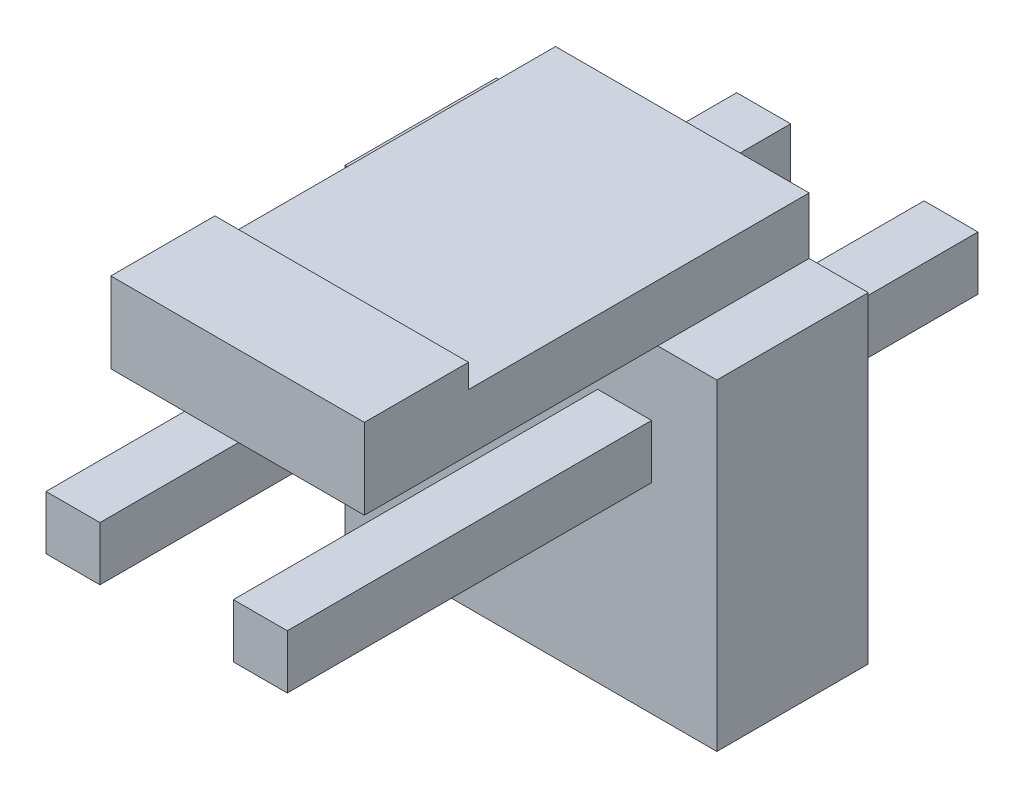
ISO-10303-21;
HEADER;
FILE_DESCRIPTION(('STEP AP214'),'2;1');
FILE_NAME('part.step','',(''),(''),'','','');
FILE_SCHEMA(('AUTOMOTIVE_DESIGN { 1 0 10303 214 1 1 1 1 }'));
ENDSEC;
DATA;
#1=APPLICATION_CONTEXT('core data for automotive mechanical design processes');
#2=APPLICATION_PROTOCOL_DEFINITION('international standard','automotive_design',2000,#1);
#3=PRODUCT_CONTEXT('',#1,'mechanical');
#4=PRODUCT('Part','Part','',(#3));
#5=PRODUCT_RELATED_PRODUCT_CATEGORY('part','',(#4));
#6=PRODUCT_DEFINITION_FORMATION('','',#4);
#7=PRODUCT_DEFINITION_CONTEXT('part definition',#1,'design');
#8=PRODUCT_DEFINITION('design','',#6,#7);
#9=PRODUCT_DEFINITION_SHAPE('','',#8);
#10=(LENGTH_UNIT() NAMED_UNIT(*) SI_UNIT(.MILLI.,.METRE.));
#11=(NAMED_UNIT(*) PLANE_ANGLE_UNIT() SI_UNIT($,.RADIAN.));
#12=(NAMED_UNIT(*) SI_UNIT($,.STERADIAN.) SOLID_ANGLE_UNIT());
#13=UNCERTAINTY_MEASURE_WITH_UNIT(LENGTH_MEASURE(1.E-05),#10,'distance_accuracy_value','');
#14=(GEOMETRIC_REPRESENTATION_CONTEXT(3) GLOBAL_UNCERTAINTY_ASSIGNED_CONTEXT((#13)) GLOBAL_UNIT_ASSIGNED_CONTEXT((#10,
#11,#12)) REPRESENTATION_CONTEXT('',''));
#15=CARTESIAN_POINT('',(0.,0.,0.));
#16=DIRECTION('',(0.,0.,1.));
#17=DIRECTION('',(1.,0.,0.));
#18=AXIS2_PLACEMENT_3D('',#15,#16,#17);
#19=CARTESIAN_POINT('',(1.41000000000004,0.495315795898456,10.9));
#20=DIRECTION('',(1.,0.,0.));
#21=DIRECTION('',(0.,0.,-1.));
#22=AXIS2_PLACEMENT_3D('',#19,#20,#21);
#23=PLANE('',#22);
#24=DIRECTION('',(0.,0.,1.));
#25=VECTOR('',#24,1.);
#26=CARTESIAN_POINT('',(1.41,-0.644684204101545,10.9));
#27=LINE('',#26,#25);
#28=CARTESIAN_POINT('',(1.41,-0.644684204101562,3.2));
#29=VERTEX_POINT('',#28);
#30=CARTESIAN_POINT('',(1.41000000000003,-0.644684204101545,10.9));
#31=VERTEX_POINT('',#30);
#32=EDGE_CURVE('E11',#29,#31,#27,.T.);
#33=ORIENTED_EDGE('',*,*,#32,.T.);
#34=DIRECTION('',(0.,-1.,0.));
#35=VECTOR('',#34,1.);
#36=CARTESIAN_POINT('',(1.41000000000004,-0.644684204101545,10.9));
#37=LINE('',#36,#35);
#38=CARTESIAN_POINT('',(1.41000000000004,0.495315795898449,10.9));
#39=VERTEX_POINT('',#38);
#40=EDGE_CURVE('E407',#39,#31,#37,.T.);
#41=ORIENTED_EDGE('',*,*,#40,.F.);
#42=DIRECTION('',(0.,0.,-1.));
#43=VECTOR('',#42,1.);
#44=CARTESIAN_POINT('',(1.41000000000004,0.495315795898456,10.9));
#45=LINE('',#44,#43);
#46=CARTESIAN_POINT('',(1.41000000000002,0.495315795898425,3.2));
#47=VERTEX_POINT('',#46);
#48=EDGE_CURVE('E388',#39,#47,#45,.T.);
#49=ORIENTED_EDGE('',*,*,#48,.T.);
#50=DIRECTION('',(0.,1.,0.));
#51=VECTOR('',#50,1.);
#52=CARTESIAN_POINT('',(1.41,0.495315795898453,3.2));
#53=LINE('',#52,#51);
#54=EDGE_CURVE('E300',#29,#47,#53,.T.);
#55=ORIENTED_EDGE('',*,*,#54,.F.);
#56=EDGE_LOOP('',(#33,#41,#49,#55));
#57=FACE_BOUND('',#56,.T.);
#58=ADVANCED_FACE('F17',(#57),#23,.F.);
#59=CARTESIAN_POINT('',(-2.54999999999996,0.495315795898457,10.9));
#60=DIRECTION('',(1.,0.,0.));
#61=DIRECTION('',(0.,0.,-1.));
#62=AXIS2_PLACEMENT_3D('',#59,#60,#61);
#63=PLANE('',#62);
#64=DIRECTION('',(0.,0.,1.));
#65=VECTOR('',#64,1.);
#66=CARTESIAN_POINT('',(-2.55,-0.644684204101544,10.9));
#67=LINE('',#66,#65);
#68=CARTESIAN_POINT('',(-2.55,-0.64468420410156,3.2));
#69=VERTEX_POINT('',#68);
#70=CARTESIAN_POINT('',(-2.55,-0.644684204101544,10.9));
#71=VERTEX_POINT('',#70);
#72=EDGE_CURVE('E392',#69,#71,#67,.T.);
#73=ORIENTED_EDGE('',*,*,#72,.T.);
#74=DIRECTION('',(0.,-1.,0.));
#75=VECTOR('',#74,1.);
#76=CARTESIAN_POINT('',(-2.54999999999996,-0.644684204101544,10.9));
#77=LINE('',#76,#75);
#78=CARTESIAN_POINT('',(-2.54999999999996,0.495315795898449,10.9));
#79=VERTEX_POINT('',#78);
#80=EDGE_CURVE('E336',#79,#71,#77,.T.);
#81=ORIENTED_EDGE('',*,*,#80,.F.);
#82=DIRECTION('',(0.,0.,-1.));
#83=VECTOR('',#82,1.);
#84=CARTESIAN_POINT('',(-2.54999999999996,0.495315795898457,10.9));
#85=LINE('',#84,#83);
#86=CARTESIAN_POINT('',(-2.55,0.495315795898426,3.2));
#87=VERTEX_POINT('',#86);
#88=EDGE_CURVE('E387',#79,#87,#85,.T.);
#89=ORIENTED_EDGE('',*,*,#88,.T.);
#90=DIRECTION('',(0.,1.,0.));
#91=VECTOR('',#90,1.);
#92=CARTESIAN_POINT('',(-2.55,0.495315795898454,3.2));
#93=LINE('',#92,#91);
#94=EDGE_CURVE('E350',#69,#87,#93,.T.);
#95=ORIENTED_EDGE('',*,*,#94,.F.);
#96=EDGE_LOOP('',(#73,#81,#89,#95));
#97=FACE_BOUND('',#96,.T.);
#98=ADVANCED_FACE('F611',(#97),#63,.F.);
#99=CARTESIAN_POINT('',(1.41000000000004,-0.644684204101545,10.9));
#100=DIRECTION('',(0.,1.,0.));
#101=DIRECTION('',(0.,0.,-1.));
#102=AXIS2_PLACEMENT_3D('',#99,#100,#101);
#103=PLANE('',#102);
#104=DIRECTION('',(0.,0.,1.));
#105=VECTOR('',#104,1.);
#106=CARTESIAN_POINT('',(2.55000000000004,-0.644684204101574,10.9));
#107=LINE('',#106,#105);
#108=CARTESIAN_POINT('',(2.55,-0.644684204101576,3.2));
#109=VERTEX_POINT('',#108);
#110=CARTESIAN_POINT('',(2.55000000000004,-0.644684204101552,10.9));
#111=VERTEX_POINT('',#110);
#112=EDGE_CURVE('E396',#109,#111,#107,.T.);
#113=ORIENTED_EDGE('',*,*,#112,.T.);
#114=DIRECTION('',(1.,0.,0.));
#115=VECTOR('',#114,1.);
#116=CARTESIAN_POINT('',(1.41000000000004,-0.644684204101545,10.9));
#117=LINE('',#116,#115);
#118=EDGE_CURVE('E28',#31,#111,#117,.T.);
#119=ORIENTED_EDGE('',*,*,#118,.F.);
#120=ORIENTED_EDGE('',*,*,#32,.F.);
#121=DIRECTION('',(-1.,0.,0.));
#122=VECTOR('',#121,1.);
#123=CARTESIAN_POINT('',(1.41000000000004,-0.644684204101576,3.2));
#124=LINE('',#123,#122);
#125=EDGE_CURVE('E428',#109,#29,#124,.T.);
#126=ORIENTED_EDGE('',*,*,#125,.F.);
#127=EDGE_LOOP('',(#113,#119,#120,#126));
#128=FACE_BOUND('',#127,.T.);
#129=ADVANCED_FACE('F557',(#128),#103,.F.);
#130=CARTESIAN_POINT('',(1.41000000000004,-0.644684204101545,10.9));
#131=DIRECTION('',(0.,0.,1.));
#132=DIRECTION('',(0.,-1.,0.));
#133=AXIS2_PLACEMENT_3D('',#130,#131,#132);
#134=PLANE('',#133);
#135=DIRECTION('',(0.,1.,0.));
#136=VECTOR('',#135,1.);
#137=CARTESIAN_POINT('',(2.55000000000004,0.495315795898455,10.9));
#138=LINE('',#137,#136);
#139=CARTESIAN_POINT('',(2.55,0.495315795898455,10.9));
#140=VERTEX_POINT('',#139);
#141=EDGE_CURVE('E303',#111,#140,#138,.T.);
#142=ORIENTED_EDGE('',*,*,#141,.T.);
#143=DIRECTION('',(-1.,0.,0.));
#144=VECTOR('',#143,1.);
#145=CARTESIAN_POINT('',(1.41000000000004,0.495315795898456,10.9));
#146=LINE('',#145,#144);
#147=EDGE_CURVE('E391',#140,#39,#146,.T.);
#148=ORIENTED_EDGE('',*,*,#147,.T.);
#149=ORIENTED_EDGE('',*,*,#40,.T.);
#150=ORIENTED_EDGE('',*,*,#118,.T.);
#151=EDGE_LOOP('',(#142,#148,#149,#150));
#152=FACE_BOUND('',#151,.T.);
#153=ADVANCED_FACE('F551',(#152),#134,.T.);
#154=CARTESIAN_POINT('',(1.41000000000004,0.495315795898456,10.9));
#155=DIRECTION('',(0.,-1.,0.));
#156=DIRECTION('',(-1.,0.,0.));
#157=AXIS2_PLACEMENT_3D('',#154,#155,#156);
#158=PLANE('',#157);
#159=ORIENTED_EDGE('',*,*,#48,.F.);
#160=ORIENTED_EDGE('',*,*,#147,.F.);
#161=DIRECTION('',(0.,0.,-1.));
#162=VECTOR('',#161,1.);
#163=CARTESIAN_POINT('',(2.55000000000004,0.495315795898455,10.9));
#164=LINE('',#163,#162);
#165=CARTESIAN_POINT('',(2.55,0.495315795898431,3.2));
#166=VERTEX_POINT('',#165);
#167=EDGE_CURVE('E301',#140,#166,#164,.T.);
#168=ORIENTED_EDGE('',*,*,#167,.T.);
#169=DIRECTION('',(1.,0.,0.));
#170=VECTOR('',#169,1.);
#171=CARTESIAN_POINT('',(1.41000000000004,0.495315795898425,3.2));
#172=LINE('',#171,#170);
#173=EDGE_CURVE('E312',#47,#166,#172,.T.);
#174=ORIENTED_EDGE('',*,*,#173,.F.);
#175=EDGE_LOOP('',(#159,#160,#168,#174));
#176=FACE_BOUND('',#175,.T.);
#177=ADVANCED_FACE('F564',(#176),#158,.F.);
#178=CARTESIAN_POINT('',(-3.93,3.62531579589847,9.4));
#179=DIRECTION('',(0.,0.,1.));
#180=DIRECTION('',(0.,-1.,0.));
#181=AXIS2_PLACEMENT_3D('',#178,#179,#180);
#182=PLANE('',#181);
#183=DIRECTION('',(0.,1.,0.));
#184=VECTOR('',#183,1.);
#185=CARTESIAN_POINT('',(2.68000000000004,3.62531579589847,9.4));
#186=LINE('',#185,#184);
#187=CARTESIAN_POINT('',(2.68,1.92531579589846,9.4));
#188=VERTEX_POINT('',#187);
#189=CARTESIAN_POINT('',(2.68000000000004,3.62531579589847,9.4));
#190=VERTEX_POINT('',#189);
#191=EDGE_CURVE('E358',#188,#190,#186,.T.);
#192=ORIENTED_EDGE('',*,*,#191,.T.);
#193=DIRECTION('',(1.,0.,0.));
#194=VECTOR('',#193,1.);
#195=CARTESIAN_POINT('',(-3.93,3.62531579589847,9.4));
#196=LINE('',#195,#194);
#197=CARTESIAN_POINT('',(-2.68,3.62531579589847,9.4));
#198=VERTEX_POINT('',#197);
#199=EDGE_CURVE('E400',#198,#190,#196,.T.);
#200=ORIENTED_EDGE('',*,*,#199,.F.);
#201=DIRECTION('',(0.,-1.,0.));
#202=VECTOR('',#201,1.);
#203=CARTESIAN_POINT('',(-2.67999999999996,3.62531579589847,9.4));
#204=LINE('',#203,#202);
#205=CARTESIAN_POINT('',(-2.67999999999996,1.92531579589848,9.4));
#206=VERTEX_POINT('',#205);
#207=EDGE_CURVE('E424',#198,#206,#204,.T.);
#208=ORIENTED_EDGE('',*,*,#207,.T.);
#209=DIRECTION('',(-1.,0.,0.));
#210=VECTOR('',#209,1.);
#211=CARTESIAN_POINT('',(-3.93,1.92531579589847,9.4));
#212=LINE('',#211,#210);
#213=EDGE_CURVE('E304',#188,#206,#212,.T.);
#214=ORIENTED_EDGE('',*,*,#213,.F.);
#215=EDGE_LOOP('',(#192,#200,#208,#214));
#216=FACE_BOUND('',#215,.T.);
#217=ADVANCED_FACE('F631',(#216),#182,.T.);
#218=CARTESIAN_POINT('',(-2.54999999999996,-0.644684204101544,10.9));
#219=DIRECTION('',(0.,1.,0.));
#220=DIRECTION('',(0.,0.,-1.));
#221=AXIS2_PLACEMENT_3D('',#218,#219,#220);
#222=PLANE('',#221);
#223=DIRECTION('',(0.,0.,1.));
#224=VECTOR('',#223,1.);
#225=CARTESIAN_POINT('',(-1.40999999999996,-0.644684204101573,10.9));
#226=LINE('',#225,#224);
#227=CARTESIAN_POINT('',(-1.40999999999997,-0.644684204101575,3.2));
#228=VERTEX_POINT('',#227);
#229=CARTESIAN_POINT('',(-1.40999999999996,-0.644684204101551,10.9));
#230=VERTEX_POINT('',#229);
#231=EDGE_CURVE('E454',#228,#230,#226,.T.);
#232=ORIENTED_EDGE('',*,*,#231,.T.);
#233=DIRECTION('',(1.,0.,0.));
#234=VECTOR('',#233,1.);
#235=CARTESIAN_POINT('',(-2.54999999999996,-0.644684204101544,10.9));
#236=LINE('',#235,#234);
#237=EDGE_CURVE('E340',#71,#230,#236,.T.);
#238=ORIENTED_EDGE('',*,*,#237,.F.);
#239=ORIENTED_EDGE('',*,*,#72,.F.);
#240=DIRECTION('',(-1.,0.,0.));
#241=VECTOR('',#240,1.);
#242=CARTESIAN_POINT('',(-2.54999999999996,-0.644684204101575,3.2));
#243=LINE('',#242,#241);
#244=EDGE_CURVE('E335',#228,#69,#243,.T.);
#245=ORIENTED_EDGE('',*,*,#244,.F.);
#246=EDGE_LOOP('',(#232,#238,#239,#245));
#247=FACE_BOUND('',#246,.T.);
#248=ADVANCED_FACE('F649',(#247),#222,.F.);
#249=CARTESIAN_POINT('',(-2.54999999999996,-0.644684204101544,10.9));
#250=DIRECTION('',(0.,0.,1.));
#251=DIRECTION('',(0.,-1.,0.));
#252=AXIS2_PLACEMENT_3D('',#249,#250,#251);
#253=PLANE('',#252);
#254=DIRECTION('',(0.,1.,0.));
#255=VECTOR('',#254,1.);
#256=CARTESIAN_POINT('',(-1.40999999999996,0.495315795898456,10.9));
#257=LINE('',#256,#255);
#258=CARTESIAN_POINT('',(-1.40999999999996,0.495315795898456,10.9));
#259=VERTEX_POINT('',#258);
#260=EDGE_CURVE('E330',#230,#259,#257,.T.);
#261=ORIENTED_EDGE('',*,*,#260,.T.);
#262=DIRECTION('',(-1.,0.,0.));
#263=VECTOR('',#262,1.);
#264=CARTESIAN_POINT('',(-2.54999999999996,0.495315795898457,10.9));
#265=LINE('',#264,#263);
#266=EDGE_CURVE('E341',#259,#79,#265,.T.);
#267=ORIENTED_EDGE('',*,*,#266,.T.);
#268=ORIENTED_EDGE('',*,*,#80,.T.);
#269=ORIENTED_EDGE('',*,*,#237,.T.);
#270=EDGE_LOOP('',(#261,#267,#268,#269));
#271=FACE_BOUND('',#270,.T.);
#272=ADVANCED_FACE('F645',(#271),#253,.T.);
#273=CARTESIAN_POINT('',(-2.54999999999996,0.495315795898457,10.9));
#274=DIRECTION('',(0.,-1.,0.));
#275=DIRECTION('',(-1.,0.,0.));
#276=AXIS2_PLACEMENT_3D('',#273,#274,#275);
#277=PLANE('',#276);
#278=ORIENTED_EDGE('',*,*,#88,.F.);
#279=ORIENTED_EDGE('',*,*,#266,.F.);
#280=DIRECTION('',(0.,0.,-1.));
#281=VECTOR('',#280,1.);
#282=CARTESIAN_POINT('',(-1.40999999999996,0.495315795898456,10.9));
#283=LINE('',#282,#281);
#284=CARTESIAN_POINT('',(-1.41,0.495315795898432,3.2));
#285=VERTEX_POINT('',#284);
#286=EDGE_CURVE('E327',#259,#285,#283,.T.);
#287=ORIENTED_EDGE('',*,*,#286,.T.);
#288=DIRECTION('',(1.,0.,0.));
#289=VECTOR('',#288,1.);
#290=CARTESIAN_POINT('',(-2.54999999999996,0.495315795898426,3.2));
#291=LINE('',#290,#289);
#292=EDGE_CURVE('E296',#87,#285,#291,.T.);
#293=ORIENTED_EDGE('',*,*,#292,.F.);
#294=EDGE_LOOP('',(#278,#279,#287,#293));
#295=FACE_BOUND('',#294,.T.);
#296=ADVANCED_FACE('F648',(#295),#277,.F.);
#297=CARTESIAN_POINT('',(1.41000000000004,0.495315795898456,10.9));
#298=DIRECTION('',(1.,0.,0.));
#299=DIRECTION('',(0.,0.,-1.));
#300=AXIS2_PLACEMENT_3D('',#297,#298,#299);
#301=PLANE('',#300);
#302=DIRECTION('',(0.,0.,-1.));
#303=VECTOR('',#302,1.);
#304=CARTESIAN_POINT('',(1.41,0.495315795898456,10.9));
#305=LINE('',#304,#303);
#306=CARTESIAN_POINT('',(1.41,0.495315795898405,0.));
#307=VERTEX_POINT('',#306);
#308=CARTESIAN_POINT('',(1.41,0.495315795898396,-3.7));
#309=VERTEX_POINT('',#308);
#310=EDGE_CURVE('E331',#307,#309,#305,.T.);
#311=ORIENTED_EDGE('',*,*,#310,.T.);
#312=DIRECTION('',(0.,-1.,0.));
#313=VECTOR('',#312,1.);
#314=CARTESIAN_POINT('',(1.41,-0.644684204101604,-3.7));
#315=LINE('',#314,#313);
#316=CARTESIAN_POINT('',(1.41,-0.6446842041016,-3.7));
#317=VERTEX_POINT('',#316);
#318=EDGE_CURVE('E380',#309,#317,#315,.T.);
#319=ORIENTED_EDGE('',*,*,#318,.T.);
#320=DIRECTION('',(0.,0.,1.));
#321=VECTOR('',#320,1.);
#322=CARTESIAN_POINT('',(1.41,-0.644684204101545,10.9));
#323=LINE('',#322,#321);
#324=CARTESIAN_POINT('',(1.41,-0.644684204101589,0.));
#325=VERTEX_POINT('',#324);
#326=EDGE_CURVE('E317',#317,#325,#323,.T.);
#327=ORIENTED_EDGE('',*,*,#326,.T.);
#328=DIRECTION('',(0.,-1.,0.));
#329=VECTOR('',#328,1.);
#330=CARTESIAN_POINT('',(1.41,0.495315795898452,0.));
#331=LINE('',#330,#329);
#332=EDGE_CURVE('E367',#307,#325,#331,.T.);
#333=ORIENTED_EDGE('',*,*,#332,.F.);
#334=EDGE_LOOP('',(#311,#319,#327,#333));
#335=FACE_BOUND('',#334,.T.);
#336=ADVANCED_FACE('F668',(#335),#301,.F.);
#337=CARTESIAN_POINT('',(-3.93,3.62531579589846,7.2));
#338=DIRECTION('',(0.,1.,0.));
#339=DIRECTION('',(0.,0.,-1.));
#340=AXIS2_PLACEMENT_3D('',#337,#338,#339);
#341=PLANE('',#340);
#342=DIRECTION('',(0.,0.,-1.));
#343=VECTOR('',#342,1.);
#344=CARTESIAN_POINT('',(2.68,3.62531579589847,0.));
#345=LINE('',#344,#343);
#346=CARTESIAN_POINT('',(2.68,3.62531579589846,7.2));
#347=VERTEX_POINT('',#346);
#348=EDGE_CURVE('E363',#190,#347,#345,.T.);
#349=ORIENTED_EDGE('',*,*,#348,.T.);
#350=DIRECTION('',(1.,0.,0.));
#351=VECTOR('',#350,1.);
#352=CARTESIAN_POINT('',(-3.93,3.62531579589846,7.2));
#353=LINE('',#352,#351);
#354=CARTESIAN_POINT('',(-2.68,3.62531579589846,7.2));
#355=VERTEX_POINT('',#354);
#356=EDGE_CURVE('E326',#355,#347,#353,.T.);
#357=ORIENTED_EDGE('',*,*,#356,.F.);
#358=DIRECTION('',(0.,0.,1.));
#359=VECTOR('',#358,1.);
#360=CARTESIAN_POINT('',(-2.68,3.62531579589846,0.));
#361=LINE('',#360,#359);
#362=EDGE_CURVE('E320',#355,#198,#361,.T.);
#363=ORIENTED_EDGE('',*,*,#362,.T.);
#364=ORIENTED_EDGE('',*,*,#199,.T.);
#365=EDGE_LOOP('',(#349,#357,#363,#364));
#366=FACE_BOUND('',#365,.T.);
#367=ADVANCED_FACE('F19',(#366),#341,.T.);
#368=CARTESIAN_POINT('',(2.55000000000004,0.495315795898455,10.9));
#369=DIRECTION('',(-1.,0.,0.));
#370=DIRECTION('',(0.,1.,0.));
#371=AXIS2_PLACEMENT_3D('',#368,#369,#370);
#372=PLANE('',#371);
#373=ORIENTED_EDGE('',*,*,#167,.F.);
#374=ORIENTED_EDGE('',*,*,#141,.F.);
#375=ORIENTED_EDGE('',*,*,#112,.F.);
#376=DIRECTION('',(0.,-1.,0.));
#377=VECTOR('',#376,1.);
#378=CARTESIAN_POINT('',(2.55,1.92531579589845,3.2));
#379=LINE('',#378,#377);
#380=EDGE_CURVE('E316',#166,#109,#379,.T.);
#381=ORIENTED_EDGE('',*,*,#380,.F.);
#382=EDGE_LOOP('',(#373,#374,#375,#381));
#383=FACE_BOUND('',#382,.T.);
#384=ADVANCED_FACE('F560',(#383),#372,.F.);
#385=CARTESIAN_POINT('',(-3.93,1.92531579589847,9.4));
#386=DIRECTION('',(0.,-1.,0.));
#387=DIRECTION('',(-1.,0.,0.));
#388=AXIS2_PLACEMENT_3D('',#385,#386,#387);
#389=PLANE('',#388);
#390=DIRECTION('',(0.,0.,1.));
#391=VECTOR('',#390,1.);
#392=CARTESIAN_POINT('',(2.68,1.92531579589842,0.));
#393=LINE('',#392,#391);
#394=CARTESIAN_POINT('',(2.68,1.92531579589843,3.2));
#395=VERTEX_POINT('',#394);
#396=EDGE_CURVE('E362',#395,#188,#393,.T.);
#397=ORIENTED_EDGE('',*,*,#396,.T.);
#398=ORIENTED_EDGE('',*,*,#213,.T.);
#399=DIRECTION('',(0.,0.,-1.));
#400=VECTOR('',#399,1.);
#401=CARTESIAN_POINT('',(-2.68,1.92531579589848,0.));
#402=LINE('',#401,#400);
#403=CARTESIAN_POINT('',(-2.68,1.92531579589843,3.2));
#404=VERTEX_POINT('',#403);
#405=EDGE_CURVE('E325',#206,#404,#402,.T.);
#406=ORIENTED_EDGE('',*,*,#405,.T.);
#407=DIRECTION('',(-1.,0.,0.));
#408=VECTOR('',#407,1.);
#409=CARTESIAN_POINT('',(-3.93,1.92531579589843,3.2));
#410=LINE('',#409,#408);
#411=EDGE_CURVE('E431',#395,#404,#410,.T.);
#412=ORIENTED_EDGE('',*,*,#411,.F.);
#413=EDGE_LOOP('',(#397,#398,#406,#412));
#414=FACE_BOUND('',#413,.T.);
#415=ADVANCED_FACE('F650',(#414),#389,.T.);
#416=CARTESIAN_POINT('',(-1.40999999999996,0.495315795898456,10.9));
#417=DIRECTION('',(-1.,0.,0.));
#418=DIRECTION('',(0.,1.,0.));
#419=AXIS2_PLACEMENT_3D('',#416,#417,#418);
#420=PLANE('',#419);
#421=ORIENTED_EDGE('',*,*,#286,.F.);
#422=ORIENTED_EDGE('',*,*,#260,.F.);
#423=ORIENTED_EDGE('',*,*,#231,.F.);
#424=DIRECTION('',(0.,-1.,0.));
#425=VECTOR('',#424,1.);
#426=CARTESIAN_POINT('',(-1.41,1.92531579589845,3.2));
#427=LINE('',#426,#425);
#428=EDGE_CURVE('E299',#285,#228,#427,.T.);
#429=ORIENTED_EDGE('',*,*,#428,.F.);
#430=EDGE_LOOP('',(#421,#422,#423,#429));
#431=FACE_BOUND('',#430,.T.);
#432=ADVANCED_FACE('F653',(#431),#420,.F.);
#433=CARTESIAN_POINT('',(-2.54999999999996,0.495315795898457,10.9));
#434=DIRECTION('',(1.,0.,0.));
#435=DIRECTION('',(0.,0.,-1.));
#436=AXIS2_PLACEMENT_3D('',#433,#434,#435);
#437=PLANE('',#436);
#438=DIRECTION('',(0.,0.,-1.));
#439=VECTOR('',#438,1.);
#440=CARTESIAN_POINT('',(-2.55,0.495315795898457,10.9));
#441=LINE('',#440,#439);
#442=CARTESIAN_POINT('',(-2.55,0.495315795898406,0.));
#443=VERTEX_POINT('',#442);
#444=CARTESIAN_POINT('',(-2.55,0.495315795898397,-3.7));
#445=VERTEX_POINT('',#444);
#446=EDGE_CURVE('E376',#443,#445,#441,.T.);
#447=ORIENTED_EDGE('',*,*,#446,.T.);
#448=DIRECTION('',(0.,-1.,0.));
#449=VECTOR('',#448,1.);
#450=CARTESIAN_POINT('',(-2.55,-0.644684204101603,-3.7));
#451=LINE('',#450,#449);
#452=CARTESIAN_POINT('',(-2.55,-0.644684204101599,-3.7));
#453=VERTEX_POINT('',#452);
#454=EDGE_CURVE('E373',#445,#453,#451,.T.);
#455=ORIENTED_EDGE('',*,*,#454,.T.);
#456=DIRECTION('',(0.,0.,1.));
#457=VECTOR('',#456,1.);
#458=CARTESIAN_POINT('',(-2.55,-0.644684204101544,10.9));
#459=LINE('',#458,#457);
#460=CARTESIAN_POINT('',(-2.55,-0.644684204101588,0.));
#461=VERTEX_POINT('',#460);
#462=EDGE_CURVE('E508',#453,#461,#459,.T.);
#463=ORIENTED_EDGE('',*,*,#462,.T.);
#464=DIRECTION('',(0.,-1.,0.));
#465=VECTOR('',#464,1.);
#466=CARTESIAN_POINT('',(-2.55,0.495315795898453,0.));
#467=LINE('',#466,#465);
#468=EDGE_CURVE('E372',#443,#461,#467,.T.);
#469=ORIENTED_EDGE('',*,*,#468,.F.);
#470=EDGE_LOOP('',(#447,#455,#463,#469));
#471=FACE_BOUND('',#470,.T.);
#472=ADVANCED_FACE('F586',(#471),#437,.F.);
#473=CARTESIAN_POINT('',(1.41000000000004,0.495315795898456,10.9));
#474=DIRECTION('',(0.,-1.,0.));
#475=DIRECTION('',(-1.,0.,0.));
#476=AXIS2_PLACEMENT_3D('',#473,#474,#475);
#477=PLANE('',#476);
#478=DIRECTION('',(0.,0.,-1.));
#479=VECTOR('',#478,1.);
#480=CARTESIAN_POINT('',(2.55000000000004,0.495315795898415,10.9));
#481=LINE('',#480,#479);
#482=CARTESIAN_POINT('',(2.55,0.495315795898411,0.));
#483=VERTEX_POINT('',#482);
#484=CARTESIAN_POINT('',(2.55,0.4953157958984,-3.7));
#485=VERTEX_POINT('',#484);
#486=EDGE_CURVE('E484',#483,#485,#481,.T.);
#487=ORIENTED_EDGE('',*,*,#486,.T.);
#488=DIRECTION('',(-1.,0.,0.));
#489=VECTOR('',#488,1.);
#490=CARTESIAN_POINT('',(1.41,0.495315795898396,-3.7));
#491=LINE('',#490,#489);
#492=EDGE_CURVE('E357',#485,#309,#491,.T.);
#493=ORIENTED_EDGE('',*,*,#492,.T.);
#494=ORIENTED_EDGE('',*,*,#310,.F.);
#495=DIRECTION('',(-1.,0.,0.));
#496=VECTOR('',#495,1.);
#497=CARTESIAN_POINT('',(1.41000000000004,0.495315795898412,0.));
#498=LINE('',#497,#496);
#499=EDGE_CURVE('E310',#483,#307,#498,.T.);
#500=ORIENTED_EDGE('',*,*,#499,.F.);
#501=EDGE_LOOP('',(#487,#493,#494,#500));
#502=FACE_BOUND('',#501,.T.);
#503=ADVANCED_FACE('F634',(#502),#477,.F.);
#504=CARTESIAN_POINT('',(1.41,-0.644684204101604,-3.7));
#505=DIRECTION('',(0.,0.,1.));
#506=DIRECTION('',(0.,-1.,0.));
#507=AXIS2_PLACEMENT_3D('',#504,#505,#506);
#508=PLANE('',#507);
#509=ORIENTED_EDGE('',*,*,#492,.F.);
#510=DIRECTION('',(0.,-1.,0.));
#511=VECTOR('',#510,1.);
#512=CARTESIAN_POINT('',(2.55,0.495315795898451,-3.7));
#513=LINE('',#512,#511);
#514=CARTESIAN_POINT('',(2.55,-0.644684204101604,-3.7));
#515=VERTEX_POINT('',#514);
#516=EDGE_CURVE('E481',#485,#515,#513,.T.);
#517=ORIENTED_EDGE('',*,*,#516,.T.);
#518=DIRECTION('',(-1.,0.,0.));
#519=VECTOR('',#518,1.);
#520=CARTESIAN_POINT('',(1.41000000000004,-0.644684204101604,-3.7));
#521=LINE('',#520,#519);
#522=EDGE_CURVE('E319',#515,#317,#521,.T.);
#523=ORIENTED_EDGE('',*,*,#522,.T.);
#524=ORIENTED_EDGE('',*,*,#318,.F.);
#525=EDGE_LOOP('',(#509,#517,#523,#524));
#526=FACE_BOUND('',#525,.T.);
#527=ADVANCED_FACE('F637',(#526),#508,.F.);
#528=CARTESIAN_POINT('',(1.41000000000004,-0.644684204101545,10.9));
#529=DIRECTION('',(0.,1.,0.));
#530=DIRECTION('',(0.,0.,-1.));
#531=AXIS2_PLACEMENT_3D('',#528,#529,#530);
#532=PLANE('',#531);
#533=ORIENTED_EDGE('',*,*,#326,.F.);
#534=ORIENTED_EDGE('',*,*,#522,.F.);
#535=DIRECTION('',(0.,0.,1.));
#536=VECTOR('',#535,1.);
#537=CARTESIAN_POINT('',(2.55000000000004,-0.6446842041016,10.9));
#538=LINE('',#537,#536);
#539=CARTESIAN_POINT('',(2.55,-0.644684204101593,0.));
#540=VERTEX_POINT('',#539);
#541=EDGE_CURVE('E405',#515,#540,#538,.T.);
#542=ORIENTED_EDGE('',*,*,#541,.T.);
#543=DIRECTION('',(1.,0.,0.));
#544=VECTOR('',#543,1.);
#545=CARTESIAN_POINT('',(1.41000000000004,-0.644684204101589,0.));
#546=LINE('',#545,#544);
#547=EDGE_CURVE('E311',#325,#540,#546,.T.);
#548=ORIENTED_EDGE('',*,*,#547,.F.);
#549=EDGE_LOOP('',(#533,#534,#542,#548));
#550=FACE_BOUND('',#549,.T.);
#551=ADVANCED_FACE('F643',(#550),#532,.F.);
#552=CARTESIAN_POINT('',(-2.68,1.9253157958984,0.));
#553=DIRECTION('',(0.,1.,0.));
#554=DIRECTION('',(0.,0.,-1.));
#555=AXIS2_PLACEMENT_3D('',#552,#553,#554);
#556=PLANE('',#555);
#557=DIRECTION('',(0.,0.,1.));
#558=VECTOR('',#557,1.);
#559=CARTESIAN_POINT('',(-3.93,1.92531579589842,0.));
#560=LINE('',#559,#558);
#561=CARTESIAN_POINT('',(-3.93,1.92531579589841,0.));
#562=VERTEX_POINT('',#561);
#563=CARTESIAN_POINT('',(-3.93,1.92531579589842,3.2));
#564=VERTEX_POINT('',#563);
#565=EDGE_CURVE('E402',#562,#564,#560,.T.);
#566=ORIENTED_EDGE('',*,*,#565,.T.);
#567=DIRECTION('',(-1.,0.,0.));
#568=VECTOR('',#567,1.);
#569=CARTESIAN_POINT('',(-3.93,1.92531579589843,3.2));
#570=LINE('',#569,#568);
#571=EDGE_CURVE('E128',#404,#564,#570,.T.);
#572=ORIENTED_EDGE('',*,*,#571,.F.);
#573=DIRECTION('',(0.,0.,-1.));
#574=VECTOR('',#573,1.);
#575=CARTESIAN_POINT('',(-2.68,1.92531579589843,0.));
#576=LINE('',#575,#574);
#577=CARTESIAN_POINT('',(-2.68,1.92531579589841,0.));
#578=VERTEX_POINT('',#577);
#579=EDGE_CURVE('E322',#404,#578,#576,.T.);
#580=ORIENTED_EDGE('',*,*,#579,.T.);
#581=DIRECTION('',(-1.,0.,0.));
#582=VECTOR('',#581,1.);
#583=CARTESIAN_POINT('',(-2.68,1.9253157958984,0.));
#584=LINE('',#583,#582);
#585=EDGE_CURVE('E290',#578,#562,#584,.T.);
#586=ORIENTED_EDGE('',*,*,#585,.T.);
#587=EDGE_LOOP('',(#566,#572,#580,#586));
#588=FACE_BOUND('',#587,.T.);
#589=ADVANCED_FACE('F621',(#588),#556,.T.);
#590=CARTESIAN_POINT('',(-2.68,3.12531579589844,0.));
#591=DIRECTION('',(1.,0.,0.));
#592=DIRECTION('',(0.,0.,-1.));
#593=AXIS2_PLACEMENT_3D('',#590,#591,#592);
#594=PLANE('',#593);
#595=ORIENTED_EDGE('',*,*,#579,.F.);
#596=ORIENTED_EDGE('',*,*,#405,.F.);
#597=ORIENTED_EDGE('',*,*,#207,.F.);
#598=ORIENTED_EDGE('',*,*,#362,.F.);
#599=DIRECTION('',(0.,1.,0.));
#600=VECTOR('',#599,1.);
#601=CARTESIAN_POINT('',(-2.68,3.62531579589846,7.2));
#602=LINE('',#601,#600);
#603=CARTESIAN_POINT('',(-2.68,3.12531579589845,7.2));
#604=VERTEX_POINT('',#603);
#605=EDGE_CURVE('E144',#604,#355,#602,.T.);
#606=ORIENTED_EDGE('',*,*,#605,.F.);
#607=DIRECTION('',(0.,0.,1.));
#608=VECTOR('',#607,1.);
#609=CARTESIAN_POINT('',(-2.68,3.12531579589844,0.));
#610=LINE('',#609,#608);
#611=CARTESIAN_POINT('',(-2.68,3.12531579589844,0.));
#612=VERTEX_POINT('',#611);
#613=EDGE_CURVE('E265',#612,#604,#610,.T.);
#614=ORIENTED_EDGE('',*,*,#613,.F.);
#615=DIRECTION('',(0.,1.,0.));
#616=VECTOR('',#615,1.);
#617=CARTESIAN_POINT('',(-2.68,3.12531579589844,0.));
#618=LINE('',#617,#616);
#619=EDGE_CURVE('E283',#578,#612,#618,.T.);
#620=ORIENTED_EDGE('',*,*,#619,.F.);
#621=EDGE_LOOP('',(#595,#596,#597,#598,#606,#614,#620));
#622=FACE_BOUND('',#621,.T.);
#623=ADVANCED_FACE('F617',(#622),#594,.F.);
#624=CARTESIAN_POINT('',(-3.93,3.62531579589846,7.2));
#625=DIRECTION('',(0.,0.,-1.));
#626=DIRECTION('',(0.,-1.,0.));
#627=AXIS2_PLACEMENT_3D('',#624,#625,#626);
#628=PLANE('',#627);
#629=DIRECTION('',(0.,-1.,0.));
#630=VECTOR('',#629,1.);
#631=CARTESIAN_POINT('',(2.68,3.12531579589844,7.2));
#632=LINE('',#631,#630);
#633=CARTESIAN_POINT('',(2.68,3.12531579589846,7.2));
#634=VERTEX_POINT('',#633);
#635=EDGE_CURVE('E501',#347,#634,#632,.T.);
#636=ORIENTED_EDGE('',*,*,#635,.T.);
#637=DIRECTION('',(1.,0.,0.));
#638=VECTOR('',#637,1.);
#639=CARTESIAN_POINT('',(-3.93,3.12531579589846,7.2));
#640=LINE('',#639,#638);
#641=EDGE_CURVE('E261',#604,#634,#640,.T.);
#642=ORIENTED_EDGE('',*,*,#641,.F.);
#643=ORIENTED_EDGE('',*,*,#605,.T.);
#644=ORIENTED_EDGE('',*,*,#356,.T.);
#645=EDGE_LOOP('',(#636,#642,#643,#644));
#646=FACE_BOUND('',#645,.T.);
#647=ADVANCED_FACE('F620',(#646),#628,.T.);
#648=CARTESIAN_POINT('',(2.68,3.12531579589844,0.));
#649=DIRECTION('',(-1.,0.,0.));
#650=DIRECTION('',(0.,1.,0.));
#651=AXIS2_PLACEMENT_3D('',#648,#649,#650);
#652=PLANE('',#651);
#653=DIRECTION('',(0.,0.,-1.));
#654=VECTOR('',#653,1.);
#655=CARTESIAN_POINT('',(2.68,3.12531579589844,0.));
#656=LINE('',#655,#654);
#657=CARTESIAN_POINT('',(2.68,3.12531579589845,0.));
#658=VERTEX_POINT('',#657);
#659=EDGE_CURVE('E254',#634,#658,#656,.T.);
#660=ORIENTED_EDGE('',*,*,#659,.F.);
#661=ORIENTED_EDGE('',*,*,#635,.F.);
#662=ORIENTED_EDGE('',*,*,#348,.F.);
#663=ORIENTED_EDGE('',*,*,#191,.F.);
#664=ORIENTED_EDGE('',*,*,#396,.F.);
#665=DIRECTION('',(0.,0.,-1.));
#666=VECTOR('',#665,1.);
#667=CARTESIAN_POINT('',(2.68,1.9253157958984,0.));
#668=LINE('',#667,#666);
#669=CARTESIAN_POINT('',(2.68,1.9253157958984,0.));
#670=VERTEX_POINT('',#669);
#671=EDGE_CURVE('E272',#395,#670,#668,.T.);
#672=ORIENTED_EDGE('',*,*,#671,.T.);
#673=DIRECTION('',(0.,-1.,0.));
#674=VECTOR('',#673,1.);
#675=CARTESIAN_POINT('',(2.68,3.12531579589844,0.));
#676=LINE('',#675,#674);
#677=EDGE_CURVE('E269',#658,#670,#676,.T.);
#678=ORIENTED_EDGE('',*,*,#677,.F.);
#679=EDGE_LOOP('',(#660,#661,#662,#663,#664,#672,#678));
#680=FACE_BOUND('',#679,.T.);
#681=ADVANCED_FACE('F270',(#680),#652,.F.);
#682=CARTESIAN_POINT('',(2.68,1.9253157958984,0.));
#683=DIRECTION('',(0.,-1.,0.));
#684=DIRECTION('',(-1.,0.,0.));
#685=AXIS2_PLACEMENT_3D('',#682,#683,#684);
#686=PLANE('',#685);
#687=DIRECTION('',(0.,0.,1.));
#688=VECTOR('',#687,1.);
#689=CARTESIAN_POINT('',(3.93,1.92531579589839,0.));
#690=LINE('',#689,#688);
#691=CARTESIAN_POINT('',(3.93,1.92531579589839,0.));
#692=VERTEX_POINT('',#691);
#693=CARTESIAN_POINT('',(3.93,1.92531579589842,3.2));
#694=VERTEX_POINT('',#693);
#695=EDGE_CURVE('E415',#692,#694,#690,.T.);
#696=ORIENTED_EDGE('',*,*,#695,.F.);
#697=DIRECTION('',(1.,0.,0.));
#698=VECTOR('',#697,1.);
#699=CARTESIAN_POINT('',(2.68,1.9253157958984,0.));
#700=LINE('',#699,#698);
#701=EDGE_CURVE('E277',#670,#692,#700,.T.);
#702=ORIENTED_EDGE('',*,*,#701,.F.);
#703=ORIENTED_EDGE('',*,*,#671,.F.);
#704=DIRECTION('',(-1.,0.,0.));
#705=VECTOR('',#704,1.);
#706=CARTESIAN_POINT('',(-3.93,1.92531579589845,3.2));
#707=LINE('',#706,#705);
#708=EDGE_CURVE('E433',#694,#395,#707,.T.);
#709=ORIENTED_EDGE('',*,*,#708,.F.);
#710=EDGE_LOOP('',(#696,#702,#703,#709));
#711=FACE_BOUND('',#710,.T.);
#712=ADVANCED_FACE('F694',(#711),#686,.F.);
#713=CARTESIAN_POINT('',(-3.93,1.92531579589845,3.2));
#714=DIRECTION('',(0.,0.,1.));
#715=DIRECTION('',(1.,0.,0.));
#716=AXIS2_PLACEMENT_3D('',#713,#714,#715);
#717=PLANE('',#716);
#718=ORIENTED_EDGE('',*,*,#292,.T.);
#719=ORIENTED_EDGE('',*,*,#428,.T.);
#720=ORIENTED_EDGE('',*,*,#244,.T.);
#721=ORIENTED_EDGE('',*,*,#94,.T.);
#722=EDGE_LOOP('',(#718,#719,#720,#721));
#723=FACE_BOUND('',#722,.T.);
#724=ORIENTED_EDGE('',*,*,#173,.T.);
#725=ORIENTED_EDGE('',*,*,#380,.T.);
#726=ORIENTED_EDGE('',*,*,#125,.T.);
#727=ORIENTED_EDGE('',*,*,#54,.T.);
#728=EDGE_LOOP('',(#724,#725,#726,#727));
#729=FACE_BOUND('',#728,.T.);
#730=DIRECTION('',(0.,-1.,0.));
#731=VECTOR('',#730,1.);
#732=CARTESIAN_POINT('',(-3.93,-4.87468420410156,3.2));
#733=LINE('',#732,#731);
#734=CARTESIAN_POINT('',(-3.93,-4.87468420410155,3.2));
#735=VERTEX_POINT('',#734);
#736=EDGE_CURVE('E406',#564,#735,#733,.T.);
#737=ORIENTED_EDGE('',*,*,#736,.T.);
#738=DIRECTION('',(-1.,0.,0.));
#739=VECTOR('',#738,1.);
#740=CARTESIAN_POINT('',(-3.93,-4.87468420410155,3.2));
#741=LINE('',#740,#739);
#742=CARTESIAN_POINT('',(3.93,-4.87468420410155,3.2));
#743=VERTEX_POINT('',#742);
#744=EDGE_CURVE('E419',#743,#735,#741,.T.);
#745=ORIENTED_EDGE('',*,*,#744,.F.);
#746=DIRECTION('',(0.,-1.,0.));
#747=VECTOR('',#746,1.);
#748=CARTESIAN_POINT('',(3.93,-4.87468420410156,3.2));
#749=LINE('',#748,#747);
#750=EDGE_CURVE('E266',#694,#743,#749,.T.);
#751=ORIENTED_EDGE('',*,*,#750,.F.);
#752=ORIENTED_EDGE('',*,*,#708,.T.);
#753=ORIENTED_EDGE('',*,*,#411,.T.);
#754=ORIENTED_EDGE('',*,*,#571,.T.);
#755=EDGE_LOOP('',(#737,#745,#751,#752,#753,#754));
#756=FACE_BOUND('',#755,.T.);
#757=ADVANCED_FACE('F664',(#723,#729,#756),#717,.T.);
#758=CARTESIAN_POINT('',(-2.54999999999996,0.495315795898457,10.9));
#759=DIRECTION('',(0.,-1.,0.));
#760=DIRECTION('',(-1.,0.,0.));
#761=AXIS2_PLACEMENT_3D('',#758,#759,#760);
#762=PLANE('',#761);
#763=DIRECTION('',(0.,0.,-1.));
#764=VECTOR('',#763,1.);
#765=CARTESIAN_POINT('',(-1.40999999999996,0.495315795898416,10.9));
#766=LINE('',#765,#764);
#767=CARTESIAN_POINT('',(-1.41,0.495315795898412,0.));
#768=VERTEX_POINT('',#767);
#769=CARTESIAN_POINT('',(-1.41,0.495315795898401,-3.7));
#770=VERTEX_POINT('',#769);
#771=EDGE_CURVE('E470',#768,#770,#766,.T.);
#772=ORIENTED_EDGE('',*,*,#771,.T.);
#773=DIRECTION('',(-1.,0.,0.));
#774=VECTOR('',#773,1.);
#775=CARTESIAN_POINT('',(-2.55,0.495315795898397,-3.7));
#776=LINE('',#775,#774);
#777=EDGE_CURVE('E377',#770,#445,#776,.T.);
#778=ORIENTED_EDGE('',*,*,#777,.T.);
#779=ORIENTED_EDGE('',*,*,#446,.F.);
#780=DIRECTION('',(-1.,0.,0.));
#781=VECTOR('',#780,1.);
#782=CARTESIAN_POINT('',(-2.54999999999996,0.495315795898413,0.));
#783=LINE('',#782,#781);
#784=EDGE_CURVE('E368',#768,#443,#783,.T.);
#785=ORIENTED_EDGE('',*,*,#784,.F.);
#786=EDGE_LOOP('',(#772,#778,#779,#785));
#787=FACE_BOUND('',#786,.T.);
#788=ADVANCED_FACE('F577',(#787),#762,.F.);
#789=CARTESIAN_POINT('',(-2.55,-0.644684204101603,-3.7));
#790=DIRECTION('',(0.,0.,1.));
#791=DIRECTION('',(0.,-1.,0.));
#792=AXIS2_PLACEMENT_3D('',#789,#790,#791);
#793=PLANE('',#792);
#794=ORIENTED_EDGE('',*,*,#777,.F.);
#795=DIRECTION('',(0.,-1.,0.));
#796=VECTOR('',#795,1.);
#797=CARTESIAN_POINT('',(-1.41,0.495315795898452,-3.7));
#798=LINE('',#797,#796);
#799=CARTESIAN_POINT('',(-1.41,-0.644684204101603,-3.7));
#800=VERTEX_POINT('',#799);
#801=EDGE_CURVE('E467',#770,#800,#798,.T.);
#802=ORIENTED_EDGE('',*,*,#801,.T.);
#803=DIRECTION('',(-1.,0.,0.));
#804=VECTOR('',#803,1.);
#805=CARTESIAN_POINT('',(-2.54999999999996,-0.644684204101603,-3.7));
#806=LINE('',#805,#804);
#807=EDGE_CURVE('E423',#800,#453,#806,.T.);
#808=ORIENTED_EDGE('',*,*,#807,.T.);
#809=ORIENTED_EDGE('',*,*,#454,.F.);
#810=EDGE_LOOP('',(#794,#802,#808,#809));
#811=FACE_BOUND('',#810,.T.);
#812=ADVANCED_FACE('F584',(#811),#793,.F.);
#813=CARTESIAN_POINT('',(-2.54999999999996,-0.644684204101544,10.9));
#814=DIRECTION('',(0.,1.,0.));
#815=DIRECTION('',(0.,0.,-1.));
#816=AXIS2_PLACEMENT_3D('',#813,#814,#815);
#817=PLANE('',#816);
#818=ORIENTED_EDGE('',*,*,#462,.F.);
#819=ORIENTED_EDGE('',*,*,#807,.F.);
#820=DIRECTION('',(0.,0.,1.));
#821=VECTOR('',#820,1.);
#822=CARTESIAN_POINT('',(-1.40999999999996,-0.644684204101599,10.9));
#823=LINE('',#822,#821);
#824=CARTESIAN_POINT('',(-1.41,-0.644684204101592,0.));
#825=VERTEX_POINT('',#824);
#826=EDGE_CURVE('E464',#800,#825,#823,.T.);
#827=ORIENTED_EDGE('',*,*,#826,.T.);
#828=DIRECTION('',(1.,0.,0.));
#829=VECTOR('',#828,1.);
#830=CARTESIAN_POINT('',(-2.54999999999996,-0.644684204101588,0.));
#831=LINE('',#830,#829);
#832=EDGE_CURVE('E411',#461,#825,#831,.T.);
#833=ORIENTED_EDGE('',*,*,#832,.F.);
#834=EDGE_LOOP('',(#818,#819,#827,#833));
#835=FACE_BOUND('',#834,.T.);
#836=ADVANCED_FACE('F596',(#835),#817,.F.);
#837=CARTESIAN_POINT('',(2.55000000000004,0.495315795898455,10.9));
#838=DIRECTION('',(-1.,0.,0.));
#839=DIRECTION('',(0.,1.,0.));
#840=AXIS2_PLACEMENT_3D('',#837,#838,#839);
#841=PLANE('',#840);
#842=ORIENTED_EDGE('',*,*,#541,.F.);
#843=ORIENTED_EDGE('',*,*,#516,.F.);
#844=ORIENTED_EDGE('',*,*,#486,.F.);
#845=DIRECTION('',(0.,1.,0.));
#846=VECTOR('',#845,1.);
#847=CARTESIAN_POINT('',(2.55,-4.87468420410156,0.));
#848=LINE('',#847,#846);
#849=EDGE_CURVE('E306',#540,#483,#848,.T.);
#850=ORIENTED_EDGE('',*,*,#849,.F.);
#851=EDGE_LOOP('',(#842,#843,#844,#850));
#852=FACE_BOUND('',#851,.T.);
#853=ADVANCED_FACE('F598',(#852),#841,.F.);
#854=CARTESIAN_POINT('',(-3.93,-4.87468420410156,0.));
#855=DIRECTION('',(1.,0.,0.));
#856=DIRECTION('',(0.,0.,-1.));
#857=AXIS2_PLACEMENT_3D('',#854,#855,#856);
#858=PLANE('',#857);
#859=DIRECTION('',(0.,1.,0.));
#860=VECTOR('',#859,1.);
#861=CARTESIAN_POINT('',(-3.93,-4.87468420410156,0.));
#862=LINE('',#861,#860);
#863=CARTESIAN_POINT('',(-3.93,-4.87468420410156,0.));
#864=VERTEX_POINT('',#863);
#865=EDGE_CURVE('E342',#864,#562,#862,.T.);
#866=ORIENTED_EDGE('',*,*,#865,.F.);
#867=DIRECTION('',(0.,0.,-1.));
#868=VECTOR('',#867,1.);
#869=CARTESIAN_POINT('',(-3.93,-4.87468420410155,3.2));
#870=LINE('',#869,#868);
#871=EDGE_CURVE('E453',#735,#864,#870,.T.);
#872=ORIENTED_EDGE('',*,*,#871,.F.);
#873=ORIENTED_EDGE('',*,*,#736,.F.);
#874=ORIENTED_EDGE('',*,*,#565,.F.);
#875=EDGE_LOOP('',(#866,#872,#873,#874));
#876=FACE_BOUND('',#875,.T.);
#877=ADVANCED_FACE('F605',(#876),#858,.F.);
#878=CARTESIAN_POINT('',(-3.93,3.12531579589844,0.));
#879=DIRECTION('',(0.,1.,0.));
#880=DIRECTION('',(0.,0.,-1.));
#881=AXIS2_PLACEMENT_3D('',#878,#879,#880);
#882=PLANE('',#881);
#883=ORIENTED_EDGE('',*,*,#659,.T.);
#884=DIRECTION('',(1.,0.,0.));
#885=VECTOR('',#884,1.);
#886=CARTESIAN_POINT('',(-3.93,3.12531579589844,0.));
#887=LINE('',#886,#885);
#888=EDGE_CURVE('E259',#612,#658,#887,.T.);
#889=ORIENTED_EDGE('',*,*,#888,.F.);
#890=ORIENTED_EDGE('',*,*,#613,.T.);
#891=ORIENTED_EDGE('',*,*,#641,.T.);
#892=EDGE_LOOP('',(#883,#889,#890,#891));
#893=FACE_BOUND('',#892,.T.);
#894=ADVANCED_FACE('F256',(#893),#882,.T.);
#895=CARTESIAN_POINT('',(3.93,-4.87468420410156,0.));
#896=DIRECTION('',(1.,0.,0.));
#897=DIRECTION('',(0.,0.,-1.));
#898=AXIS2_PLACEMENT_3D('',#895,#896,#897);
#899=PLANE('',#898);
#900=DIRECTION('',(0.,0.,1.));
#901=VECTOR('',#900,1.);
#902=CARTESIAN_POINT('',(3.93,-4.87468420410155,3.2));
#903=LINE('',#902,#901);
#904=CARTESIAN_POINT('',(3.93,-4.87468420410156,0.));
#905=VERTEX_POINT('',#904);
#906=EDGE_CURVE('E450',#905,#743,#903,.T.);
#907=ORIENTED_EDGE('',*,*,#906,.F.);
#908=DIRECTION('',(0.,-1.,0.));
#909=VECTOR('',#908,1.);
#910=CARTESIAN_POINT('',(3.93,-4.87468420410156,0.));
#911=LINE('',#910,#909);
#912=EDGE_CURVE('E21',#692,#905,#911,.T.);
#913=ORIENTED_EDGE('',*,*,#912,.F.);
#914=ORIENTED_EDGE('',*,*,#695,.T.);
#915=ORIENTED_EDGE('',*,*,#750,.T.);
#916=EDGE_LOOP('',(#907,#913,#914,#915));
#917=FACE_BOUND('',#916,.T.);
#918=ADVANCED_FACE('F622',(#917),#899,.T.);
#919=CARTESIAN_POINT('',(-3.93,-4.87468420410155,3.2));
#920=DIRECTION('',(0.,-1.,0.));
#921=DIRECTION('',(-1.,0.,0.));
#922=AXIS2_PLACEMENT_3D('',#919,#920,#921);
#923=PLANE('',#922);
#924=ORIENTED_EDGE('',*,*,#871,.T.);
#925=DIRECTION('',(-1.,0.,0.));
#926=VECTOR('',#925,1.);
#927=CARTESIAN_POINT('',(-3.93,-4.87468420410156,0.));
#928=LINE('',#927,#926);
#929=EDGE_CURVE('E346',#905,#864,#928,.T.);
#930=ORIENTED_EDGE('',*,*,#929,.F.);
#931=ORIENTED_EDGE('',*,*,#906,.T.);
#932=ORIENTED_EDGE('',*,*,#744,.T.);
#933=EDGE_LOOP('',(#924,#930,#931,#932));
#934=FACE_BOUND('',#933,.T.);
#935=ADVANCED_FACE('F625',(#934),#923,.T.);
#936=CARTESIAN_POINT('',(-1.40999999999996,0.495315795898456,10.9));
#937=DIRECTION('',(-1.,0.,0.));
#938=DIRECTION('',(0.,1.,0.));
#939=AXIS2_PLACEMENT_3D('',#936,#937,#938);
#940=PLANE('',#939);
#941=ORIENTED_EDGE('',*,*,#826,.F.);
#942=ORIENTED_EDGE('',*,*,#801,.F.);
#943=ORIENTED_EDGE('',*,*,#771,.F.);
#944=DIRECTION('',(0.,1.,0.));
#945=VECTOR('',#944,1.);
#946=CARTESIAN_POINT('',(-1.41,-4.87468420410156,0.));
#947=LINE('',#946,#945);
#948=EDGE_CURVE('E294',#825,#768,#947,.T.);
#949=ORIENTED_EDGE('',*,*,#948,.F.);
#950=EDGE_LOOP('',(#941,#942,#943,#949));
#951=FACE_BOUND('',#950,.T.);
#952=ADVANCED_FACE('F582',(#951),#940,.F.);
#953=CARTESIAN_POINT('',(-3.93,-4.87468420410156,0.));
#954=DIRECTION('',(0.,0.,-1.));
#955=DIRECTION('',(0.,-1.,0.));
#956=AXIS2_PLACEMENT_3D('',#953,#954,#955);
#957=PLANE('',#956);
#958=ORIENTED_EDGE('',*,*,#832,.T.);
#959=ORIENTED_EDGE('',*,*,#948,.T.);
#960=ORIENTED_EDGE('',*,*,#784,.T.);
#961=ORIENTED_EDGE('',*,*,#468,.T.);
#962=EDGE_LOOP('',(#958,#959,#960,#961));
#963=FACE_BOUND('',#962,.T.);
#964=ORIENTED_EDGE('',*,*,#547,.T.);
#965=ORIENTED_EDGE('',*,*,#849,.T.);
#966=ORIENTED_EDGE('',*,*,#499,.T.);
#967=ORIENTED_EDGE('',*,*,#332,.T.);
#968=EDGE_LOOP('',(#964,#965,#966,#967));
#969=FACE_BOUND('',#968,.T.);
#970=ORIENTED_EDGE('',*,*,#912,.T.);
#971=ORIENTED_EDGE('',*,*,#929,.T.);
#972=ORIENTED_EDGE('',*,*,#865,.T.);
#973=ORIENTED_EDGE('',*,*,#585,.F.);
#974=ORIENTED_EDGE('',*,*,#619,.T.);
#975=ORIENTED_EDGE('',*,*,#888,.T.);
#976=ORIENTED_EDGE('',*,*,#677,.T.);
#977=ORIENTED_EDGE('',*,*,#701,.T.);
#978=EDGE_LOOP('',(#970,#971,#972,#973,#974,#975,#976,#977));
#979=FACE_BOUND('',#978,.T.);
#980=ADVANCED_FACE('F280',(#963,#969,#979),#957,.T.);
#981=CLOSED_SHELL('',(#58,#98,#129,#153,#177,#217,#248,#272,#296,#336,#367,#384,#415,#432,#472,
#503,#527,#551,#589,#623,#647,#681,#712,#757,#788,#812,#836,#853,#877,#894,#918,#935,#952,#980));
#982=MANIFOLD_SOLID_BREP('B1',#981);
#983=ADVANCED_BREP_SHAPE_REPRESENTATION('',(#18,#982),#14);
#984=SHAPE_DEFINITION_REPRESENTATION(#9,#983);
ENDSEC;
END-ISO-10303-21;
